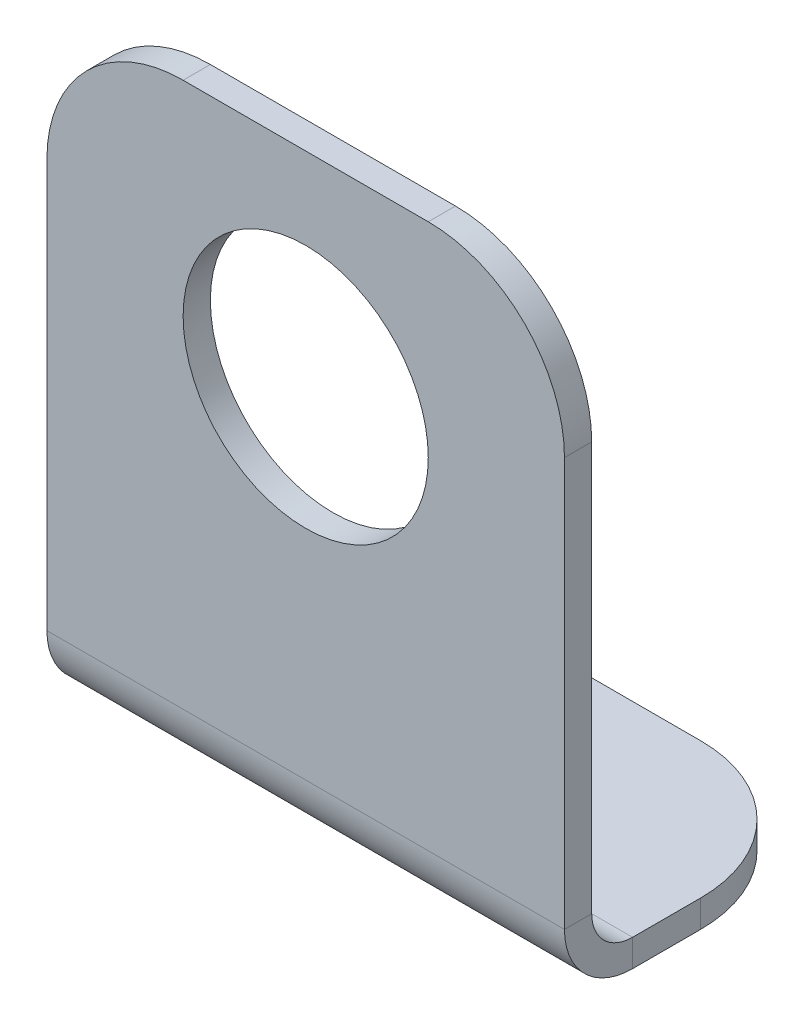
ISO-10303-21;
HEADER;
FILE_DESCRIPTION(('STEP AP214'),'2;1');
FILE_NAME('part.step','',(''),(''),'','','');
FILE_SCHEMA(('AUTOMOTIVE_DESIGN { 1 0 10303 214 1 1 1 1 }'));
ENDSEC;
DATA;
#1=APPLICATION_CONTEXT('core data for automotive mechanical design processes');
#2=APPLICATION_PROTOCOL_DEFINITION('international standard','automotive_design',2000,#1);
#3=PRODUCT_CONTEXT('',#1,'mechanical');
#4=PRODUCT('Part','Part','',(#3));
#5=PRODUCT_RELATED_PRODUCT_CATEGORY('part','',(#4));
#6=PRODUCT_DEFINITION_FORMATION('','',#4);
#7=PRODUCT_DEFINITION_CONTEXT('part definition',#1,'design');
#8=PRODUCT_DEFINITION('design','',#6,#7);
#9=PRODUCT_DEFINITION_SHAPE('','',#8);
#10=(LENGTH_UNIT() NAMED_UNIT(*) SI_UNIT(.MILLI.,.METRE.));
#11=(NAMED_UNIT(*) PLANE_ANGLE_UNIT() SI_UNIT($,.RADIAN.));
#12=(NAMED_UNIT(*) SI_UNIT($,.STERADIAN.) SOLID_ANGLE_UNIT());
#13=UNCERTAINTY_MEASURE_WITH_UNIT(LENGTH_MEASURE(1.E-05),#10,'distance_accuracy_value','');
#14=(GEOMETRIC_REPRESENTATION_CONTEXT(3) GLOBAL_UNCERTAINTY_ASSIGNED_CONTEXT((#13)) GLOBAL_UNIT_ASSIGNED_CONTEXT((#10,
#11,#12)) REPRESENTATION_CONTEXT('',''));
#15=CARTESIAN_POINT('',(0.,0.,0.));
#16=DIRECTION('',(0.,0.,1.));
#17=DIRECTION('',(1.,0.,0.));
#18=AXIS2_PLACEMENT_3D('',#15,#16,#17);
#19=CARTESIAN_POINT('',(-19.,15.,-2.));
#20=DIRECTION('',(0.,1.,0.));
#21=DIRECTION('',(0.,0.,1.));
#22=AXIS2_PLACEMENT_3D('',#19,#20,#21);
#23=PLANE('',#22);
#24=DIRECTION('',(-1.,0.,0.));
#25=VECTOR('',#24,1.);
#26=CARTESIAN_POINT('',(-19.,15.,0.));
#27=LINE('',#26,#25);
#28=CARTESIAN_POINT('',(9.,15.,0.));
#29=VERTEX_POINT('',#28);
#30=CARTESIAN_POINT('',(-9.,15.,0.));
#31=VERTEX_POINT('',#30);
#32=EDGE_CURVE('E210',#29,#31,#27,.T.);
#33=ORIENTED_EDGE('',*,*,#32,.F.);
#34=DIRECTION('',(0.,0.,1.));
#35=VECTOR('',#34,1.);
#36=CARTESIAN_POINT('',(9.,15.,-2.));
#37=LINE('',#36,#35);
#38=CARTESIAN_POINT('',(9.,15.,-2.));
#39=VERTEX_POINT('',#38);
#40=EDGE_CURVE('E262',#29,#39,#37,.F.);
#41=ORIENTED_EDGE('',*,*,#40,.T.);
#42=DIRECTION('',(-1.,0.,0.));
#43=VECTOR('',#42,1.);
#44=CARTESIAN_POINT('',(-19.,15.,-2.));
#45=LINE('',#44,#43);
#46=CARTESIAN_POINT('',(-9.,15.,-2.));
#47=VERTEX_POINT('',#46);
#48=EDGE_CURVE('E213',#39,#47,#45,.T.);
#49=ORIENTED_EDGE('',*,*,#48,.T.);
#50=DIRECTION('',(0.,0.,1.));
#51=VECTOR('',#50,1.);
#52=CARTESIAN_POINT('',(-9.,15.,-2.));
#53=LINE('',#52,#51);
#54=EDGE_CURVE('E259',#47,#31,#53,.T.);
#55=ORIENTED_EDGE('',*,*,#54,.T.);
#56=EDGE_LOOP('',(#33,#41,#49,#55));
#57=FACE_BOUND('',#56,.T.);
#58=ADVANCED_FACE('F58',(#57),#23,.T.);
#59=CARTESIAN_POINT('',(19.,-25.,-2.));
#60=DIRECTION('',(1.,0.,0.));
#61=DIRECTION('',(0.,1.,0.));
#62=AXIS2_PLACEMENT_3D('',#59,#60,#61);
#63=PLANE('',#62);
#64=DIRECTION('',(0.,1.,0.));
#65=VECTOR('',#64,1.);
#66=CARTESIAN_POINT('',(19.,-25.,-2.));
#67=LINE('',#66,#65);
#68=CARTESIAN_POINT('',(19.,-25.,-2.));
#69=VERTEX_POINT('',#68);
#70=CARTESIAN_POINT('',(19.,5.,-2.));
#71=VERTEX_POINT('',#70);
#72=EDGE_CURVE('E220',#69,#71,#67,.T.);
#73=ORIENTED_EDGE('',*,*,#72,.T.);
#74=DIRECTION('',(0.,0.,1.));
#75=VECTOR('',#74,1.);
#76=CARTESIAN_POINT('',(19.,5.,-2.));
#77=LINE('',#76,#75);
#78=CARTESIAN_POINT('',(19.,5.,0.));
#79=VERTEX_POINT('',#78);
#80=EDGE_CURVE('E252',#71,#79,#77,.T.);
#81=ORIENTED_EDGE('',*,*,#80,.T.);
#82=DIRECTION('',(0.,1.,0.));
#83=VECTOR('',#82,1.);
#84=CARTESIAN_POINT('',(19.,-25.,0.));
#85=LINE('',#84,#83);
#86=CARTESIAN_POINT('',(19.,-25.,0.));
#87=VERTEX_POINT('',#86);
#88=EDGE_CURVE('E216',#87,#79,#85,.T.);
#89=ORIENTED_EDGE('',*,*,#88,.F.);
#90=DIRECTION('',(0.,0.,1.));
#91=VECTOR('',#90,1.);
#92=CARTESIAN_POINT('',(19.,-25.,-2.));
#93=LINE('',#92,#91);
#94=EDGE_CURVE('E231',#69,#87,#93,.T.);
#95=ORIENTED_EDGE('',*,*,#94,.F.);
#96=EDGE_LOOP('',(#73,#81,#89,#95));
#97=FACE_BOUND('',#96,.T.);
#98=ADVANCED_FACE('F273',(#97),#63,.T.);
#99=CARTESIAN_POINT('',(-19.,15.,-2.));
#100=DIRECTION('',(-1.,0.,0.));
#101=DIRECTION('',(0.,-1.,0.));
#102=AXIS2_PLACEMENT_3D('',#99,#100,#101);
#103=PLANE('',#102);
#104=DIRECTION('',(0.,-1.,0.));
#105=VECTOR('',#104,1.);
#106=CARTESIAN_POINT('',(-19.,15.,0.));
#107=LINE('',#106,#105);
#108=CARTESIAN_POINT('',(-19.,5.,0.));
#109=VERTEX_POINT('',#108);
#110=CARTESIAN_POINT('',(-19.,-25.,0.));
#111=VERTEX_POINT('',#110);
#112=EDGE_CURVE('E226',#109,#111,#107,.T.);
#113=ORIENTED_EDGE('',*,*,#112,.F.);
#114=DIRECTION('',(0.,0.,1.));
#115=VECTOR('',#114,1.);
#116=CARTESIAN_POINT('',(-19.,5.,-2.));
#117=LINE('',#116,#115);
#118=CARTESIAN_POINT('',(-19.,5.,-2.));
#119=VERTEX_POINT('',#118);
#120=EDGE_CURVE('E13',#109,#119,#117,.F.);
#121=ORIENTED_EDGE('',*,*,#120,.T.);
#122=DIRECTION('',(0.,-1.,0.));
#123=VECTOR('',#122,1.);
#124=CARTESIAN_POINT('',(-19.,15.,-2.));
#125=LINE('',#124,#123);
#126=CARTESIAN_POINT('',(-19.,-25.,-2.));
#127=VERTEX_POINT('',#126);
#128=EDGE_CURVE('E215',#119,#127,#125,.T.);
#129=ORIENTED_EDGE('',*,*,#128,.T.);
#130=DIRECTION('',(0.,0.,1.));
#131=VECTOR('',#130,1.);
#132=CARTESIAN_POINT('',(-19.,-25.,-2.));
#133=LINE('',#132,#131);
#134=EDGE_CURVE('E223',#127,#111,#133,.T.);
#135=ORIENTED_EDGE('',*,*,#134,.T.);
#136=EDGE_LOOP('',(#113,#121,#129,#135));
#137=FACE_BOUND('',#136,.T.);
#138=ADVANCED_FACE('F282',(#137),#103,.T.);
#139=CARTESIAN_POINT('',(0.,0.,-2.));
#140=DIRECTION('',(0.,0.,1.));
#141=DIRECTION('',(1.,0.,0.));
#142=AXIS2_PLACEMENT_3D('',#139,#140,#141);
#143=PLANE('',#142);
#144=CARTESIAN_POINT('',(0.,0.,-2.));
#145=DIRECTION('',(0.,0.,1.));
#146=DIRECTION('',(1.,0.,0.));
#147=AXIS2_PLACEMENT_3D('',#144,#145,#146);
#148=CIRCLE('',#147,9.);
#149=CARTESIAN_POINT('',(9.,0.,-2.));
#150=VERTEX_POINT('',#149);
#151=EDGE_CURVE('E207',#150,#150,#148,.T.);
#152=ORIENTED_EDGE('',*,*,#151,.T.);
#153=EDGE_LOOP('',(#152));
#154=FACE_BOUND('',#153,.T.);
#155=ORIENTED_EDGE('',*,*,#48,.F.);
#156=CARTESIAN_POINT('',(9.,5.,-2.));
#157=DIRECTION('',(0.,0.,1.));
#158=DIRECTION('',(1.,0.,0.));
#159=AXIS2_PLACEMENT_3D('',#156,#157,#158);
#160=CIRCLE('',#159,10.);
#161=EDGE_CURVE('E66',#39,#71,#160,.F.);
#162=ORIENTED_EDGE('',*,*,#161,.T.);
#163=ORIENTED_EDGE('',*,*,#72,.F.);
#164=DIRECTION('',(1.,0.,0.));
#165=VECTOR('',#164,1.);
#166=CARTESIAN_POINT('',(-19.,-25.,-2.));
#167=LINE('',#166,#165);
#168=EDGE_CURVE('E218',#127,#69,#167,.T.);
#169=ORIENTED_EDGE('',*,*,#168,.F.);
#170=ORIENTED_EDGE('',*,*,#128,.F.);
#171=CARTESIAN_POINT('',(-9.,5.,-2.));
#172=DIRECTION('',(0.,0.,1.));
#173=DIRECTION('',(1.,0.,0.));
#174=AXIS2_PLACEMENT_3D('',#171,#172,#173);
#175=CIRCLE('',#174,10.);
#176=EDGE_CURVE('E78',#119,#47,#175,.F.);
#177=ORIENTED_EDGE('',*,*,#176,.T.);
#178=EDGE_LOOP('',(#155,#162,#163,#169,#170,#177));
#179=FACE_BOUND('',#178,.T.);
#180=ADVANCED_FACE('F266',(#154,#179),#143,.F.);
#181=CARTESIAN_POINT('',(0.,0.,0.));
#182=DIRECTION('',(0.,0.,1.));
#183=DIRECTION('',(1.,0.,0.));
#184=AXIS2_PLACEMENT_3D('',#181,#182,#183);
#185=PLANE('',#184);
#186=CARTESIAN_POINT('',(0.,0.,0.));
#187=DIRECTION('',(0.,0.,1.));
#188=DIRECTION('',(1.,0.,0.));
#189=AXIS2_PLACEMENT_3D('',#186,#187,#188);
#190=CIRCLE('',#189,9.);
#191=CARTESIAN_POINT('',(9.,0.,0.));
#192=VERTEX_POINT('',#191);
#193=EDGE_CURVE('E202',#192,#192,#190,.T.);
#194=ORIENTED_EDGE('',*,*,#193,.F.);
#195=EDGE_LOOP('',(#194));
#196=FACE_BOUND('',#195,.T.);
#197=ORIENTED_EDGE('',*,*,#88,.T.);
#198=CARTESIAN_POINT('',(9.,5.,0.));
#199=DIRECTION('',(0.,0.,1.));
#200=DIRECTION('',(1.,0.,0.));
#201=AXIS2_PLACEMENT_3D('',#198,#199,#200);
#202=CIRCLE('',#201,10.);
#203=EDGE_CURVE('E257',#79,#29,#202,.T.);
#204=ORIENTED_EDGE('',*,*,#203,.T.);
#205=ORIENTED_EDGE('',*,*,#32,.T.);
#206=CARTESIAN_POINT('',(-9.,5.,0.));
#207=DIRECTION('',(0.,0.,1.));
#208=DIRECTION('',(1.,0.,0.));
#209=AXIS2_PLACEMENT_3D('',#206,#207,#208);
#210=CIRCLE('',#209,10.);
#211=EDGE_CURVE('E255',#31,#109,#210,.T.);
#212=ORIENTED_EDGE('',*,*,#211,.T.);
#213=ORIENTED_EDGE('',*,*,#112,.T.);
#214=DIRECTION('',(1.,0.,0.));
#215=VECTOR('',#214,1.);
#216=CARTESIAN_POINT('',(-19.,-25.,0.));
#217=LINE('',#216,#215);
#218=EDGE_CURVE('E155',#111,#87,#217,.T.);
#219=ORIENTED_EDGE('',*,*,#218,.T.);
#220=EDGE_LOOP('',(#197,#204,#205,#212,#213,#219));
#221=FACE_BOUND('',#220,.T.);
#222=ADVANCED_FACE('F278',(#196,#221),#185,.T.);
#223=CARTESIAN_POINT('',(0.,0.,-2.));
#224=DIRECTION('',(0.,0.,1.));
#225=DIRECTION('',(1.,0.,0.));
#226=AXIS2_PLACEMENT_3D('',#223,#224,#225);
#227=CYLINDRICAL_SURFACE('',#226,9.);
#228=ORIENTED_EDGE('',*,*,#151,.F.);
#229=EDGE_LOOP('',(#228));
#230=FACE_BOUND('',#229,.T.);
#231=ORIENTED_EDGE('',*,*,#193,.T.);
#232=EDGE_LOOP('',(#231));
#233=FACE_BOUND('',#232,.T.);
#234=ADVANCED_FACE('F308',(#230,#233),#227,.F.);
#235=CARTESIAN_POINT('',(19.,-25.,-5.));
#236=DIRECTION('',(1.,0.,0.));
#237=DIRECTION('',(0.,0.,-1.));
#238=AXIS2_PLACEMENT_3D('',#235,#236,#237);
#239=PLANE('',#238);
#240=DIRECTION('',(0.,1.,0.));
#241=VECTOR('',#240,1.);
#242=CARTESIAN_POINT('',(19.,-30.,-4.99999999999998));
#243=LINE('',#242,#241);
#244=CARTESIAN_POINT('',(19.,-28.,-4.99999999999999));
#245=VERTEX_POINT('',#244);
#246=CARTESIAN_POINT('',(19.,-30.,-4.99999999999998));
#247=VERTEX_POINT('',#246);
#248=EDGE_CURVE('E199',#245,#247,#243,.F.);
#249=ORIENTED_EDGE('',*,*,#248,.F.);
#250=CARTESIAN_POINT('',(19.,-25.,-5.));
#251=DIRECTION('',(-1.,0.,0.));
#252=DIRECTION('',(0.,0.,1.));
#253=AXIS2_PLACEMENT_3D('',#250,#251,#252);
#254=CIRCLE('',#253,3.);
#255=EDGE_CURVE('E160',#69,#245,#254,.F.);
#256=ORIENTED_EDGE('',*,*,#255,.F.);
#257=ORIENTED_EDGE('',*,*,#94,.T.);
#258=CARTESIAN_POINT('',(19.,-25.,-5.));
#259=DIRECTION('',(-1.,0.,0.));
#260=DIRECTION('',(0.,0.,1.));
#261=AXIS2_PLACEMENT_3D('',#258,#259,#260);
#262=CIRCLE('',#261,5.);
#263=EDGE_CURVE('E159',#87,#247,#262,.F.);
#264=ORIENTED_EDGE('',*,*,#263,.T.);
#265=EDGE_LOOP('',(#249,#256,#257,#264));
#266=FACE_BOUND('',#265,.T.);
#267=ADVANCED_FACE('F306',(#266),#239,.T.);
#268=CARTESIAN_POINT('',(-19.,-25.,-5.));
#269=DIRECTION('',(1.,0.,0.));
#270=DIRECTION('',(0.,0.,-1.));
#271=AXIS2_PLACEMENT_3D('',#268,#269,#270);
#272=PLANE('',#271);
#273=CARTESIAN_POINT('',(-19.,-25.,-5.));
#274=DIRECTION('',(-1.,0.,0.));
#275=DIRECTION('',(0.,0.,1.));
#276=AXIS2_PLACEMENT_3D('',#273,#274,#275);
#277=CIRCLE('',#276,3.);
#278=CARTESIAN_POINT('',(-19.,-28.,-4.99999999999999));
#279=VERTEX_POINT('',#278);
#280=EDGE_CURVE('E167',#279,#127,#277,.T.);
#281=ORIENTED_EDGE('',*,*,#280,.F.);
#282=DIRECTION('',(0.,1.,0.));
#283=VECTOR('',#282,1.);
#284=CARTESIAN_POINT('',(-19.,-28.,-4.99999999999999));
#285=LINE('',#284,#283);
#286=CARTESIAN_POINT('',(-19.,-30.,-4.99999999999998));
#287=VERTEX_POINT('',#286);
#288=EDGE_CURVE('E164',#279,#287,#285,.F.);
#289=ORIENTED_EDGE('',*,*,#288,.T.);
#290=CARTESIAN_POINT('',(-19.,-25.,-5.));
#291=DIRECTION('',(-1.,0.,0.));
#292=DIRECTION('',(0.,0.,1.));
#293=AXIS2_PLACEMENT_3D('',#290,#291,#292);
#294=CIRCLE('',#293,5.);
#295=EDGE_CURVE('E148',#287,#111,#294,.T.);
#296=ORIENTED_EDGE('',*,*,#295,.T.);
#297=ORIENTED_EDGE('',*,*,#134,.F.);
#298=EDGE_LOOP('',(#281,#289,#296,#297));
#299=FACE_BOUND('',#298,.T.);
#300=ADVANCED_FACE('F165',(#299),#272,.F.);
#301=CARTESIAN_POINT('',(-19.,-25.,-5.));
#302=DIRECTION('',(-1.,0.,0.));
#303=DIRECTION('',(0.,-1.,0.));
#304=AXIS2_PLACEMENT_3D('',#301,#302,#303);
#305=CYLINDRICAL_SURFACE('',#304,5.);
#306=ORIENTED_EDGE('',*,*,#218,.F.);
#307=ORIENTED_EDGE('',*,*,#295,.F.);
#308=DIRECTION('',(-1.,0.,0.));
#309=VECTOR('',#308,1.);
#310=CARTESIAN_POINT('',(19.,-30.,-4.99999999999998));
#311=LINE('',#310,#309);
#312=EDGE_CURVE('E152',#287,#247,#311,.F.);
#313=ORIENTED_EDGE('',*,*,#312,.T.);
#314=ORIENTED_EDGE('',*,*,#263,.F.);
#315=EDGE_LOOP('',(#306,#307,#313,#314));
#316=FACE_BOUND('',#315,.T.);
#317=ADVANCED_FACE('F150',(#316),#305,.T.);
#318=CARTESIAN_POINT('',(-19.,-25.,-5.));
#319=DIRECTION('',(-1.,0.,0.));
#320=DIRECTION('',(0.,-1.,0.));
#321=AXIS2_PLACEMENT_3D('',#318,#319,#320);
#322=CYLINDRICAL_SURFACE('',#321,3.);
#323=ORIENTED_EDGE('',*,*,#168,.T.);
#324=ORIENTED_EDGE('',*,*,#255,.T.);
#325=DIRECTION('',(-1.,0.,0.));
#326=VECTOR('',#325,1.);
#327=CARTESIAN_POINT('',(19.,-28.,-4.99999999999999));
#328=LINE('',#327,#326);
#329=EDGE_CURVE('E172',#245,#279,#328,.T.);
#330=ORIENTED_EDGE('',*,*,#329,.T.);
#331=ORIENTED_EDGE('',*,*,#280,.T.);
#332=EDGE_LOOP('',(#323,#324,#330,#331));
#333=FACE_BOUND('',#332,.T.);
#334=ADVANCED_FACE('F284',(#333),#322,.F.);
#335=CARTESIAN_POINT('',(-19.,-30.0000000000001,-20.));
#336=DIRECTION('',(1.,0.,0.));
#337=DIRECTION('',(0.,0.,-1.));
#338=AXIS2_PLACEMENT_3D('',#335,#336,#337);
#339=PLANE('',#338);
#340=DIRECTION('',(0.,0.,1.));
#341=VECTOR('',#340,1.);
#342=CARTESIAN_POINT('',(-19.,-28.0000000000001,-20.));
#343=LINE('',#342,#341);
#344=CARTESIAN_POINT('',(-19.,-28.,-10.));
#345=VERTEX_POINT('',#344);
#346=EDGE_CURVE('E181',#279,#345,#343,.F.);
#347=ORIENTED_EDGE('',*,*,#346,.T.);
#348=DIRECTION('',(0.,1.,0.));
#349=VECTOR('',#348,1.);
#350=CARTESIAN_POINT('',(-19.,-30.,-10.));
#351=LINE('',#350,#349);
#352=CARTESIAN_POINT('',(-19.,-30.,-10.));
#353=VERTEX_POINT('',#352);
#354=EDGE_CURVE('E185',#345,#353,#351,.F.);
#355=ORIENTED_EDGE('',*,*,#354,.T.);
#356=DIRECTION('',(0.,0.,-1.));
#357=VECTOR('',#356,1.);
#358=CARTESIAN_POINT('',(-19.,-30.,0.));
#359=LINE('',#358,#357);
#360=EDGE_CURVE('E177',#287,#353,#359,.T.);
#361=ORIENTED_EDGE('',*,*,#360,.F.);
#362=ORIENTED_EDGE('',*,*,#288,.F.);
#363=EDGE_LOOP('',(#347,#355,#361,#362));
#364=FACE_BOUND('',#363,.T.);
#365=ADVANCED_FACE('F183',(#364),#339,.F.);
#366=CARTESIAN_POINT('',(19.,-30.,-1.99999999999999));
#367=DIRECTION('',(-1.,0.,0.));
#368=DIRECTION('',(0.,0.,1.));
#369=AXIS2_PLACEMENT_3D('',#366,#367,#368);
#370=PLANE('',#369);
#371=DIRECTION('',(0.,0.,1.));
#372=VECTOR('',#371,1.);
#373=CARTESIAN_POINT('',(19.,-30.,0.));
#374=LINE('',#373,#372);
#375=CARTESIAN_POINT('',(19.,-30.,-10.));
#376=VERTEX_POINT('',#375);
#377=EDGE_CURVE('E180',#376,#247,#374,.T.);
#378=ORIENTED_EDGE('',*,*,#377,.F.);
#379=DIRECTION('',(0.,1.,0.));
#380=VECTOR('',#379,1.);
#381=CARTESIAN_POINT('',(19.,-30.,-10.));
#382=LINE('',#381,#380);
#383=CARTESIAN_POINT('',(19.,-28.,-10.));
#384=VERTEX_POINT('',#383);
#385=EDGE_CURVE('E249',#376,#384,#382,.T.);
#386=ORIENTED_EDGE('',*,*,#385,.T.);
#387=DIRECTION('',(0.,0.,-1.));
#388=VECTOR('',#387,1.);
#389=CARTESIAN_POINT('',(19.,-28.,-2.));
#390=LINE('',#389,#388);
#391=EDGE_CURVE('E187',#384,#245,#390,.F.);
#392=ORIENTED_EDGE('',*,*,#391,.T.);
#393=ORIENTED_EDGE('',*,*,#248,.T.);
#394=EDGE_LOOP('',(#378,#386,#392,#393));
#395=FACE_BOUND('',#394,.T.);
#396=ADVANCED_FACE('F303',(#395),#370,.F.);
#397=CARTESIAN_POINT('',(0.,-30.,0.));
#398=DIRECTION('',(0.,1.,0.));
#399=DIRECTION('',(0.,0.,1.));
#400=AXIS2_PLACEMENT_3D('',#397,#398,#399);
#401=PLANE('',#400);
#402=ORIENTED_EDGE('',*,*,#360,.T.);
#403=CARTESIAN_POINT('',(-8.99999999999999,-30.,-10.));
#404=DIRECTION('',(0.,1.,0.));
#405=DIRECTION('',(0.,0.,1.));
#406=AXIS2_PLACEMENT_3D('',#403,#404,#405);
#407=CIRCLE('',#406,10.);
#408=CARTESIAN_POINT('',(-8.99999999999999,-30.0000000000001,-20.));
#409=VERTEX_POINT('',#408);
#410=EDGE_CURVE('E247',#353,#409,#407,.F.);
#411=ORIENTED_EDGE('',*,*,#410,.T.);
#412=DIRECTION('',(1.,0.,0.));
#413=VECTOR('',#412,1.);
#414=CARTESIAN_POINT('',(0.,-30.0000000000001,-20.));
#415=LINE('',#414,#413);
#416=CARTESIAN_POINT('',(9.,-30.0000000000001,-20.));
#417=VERTEX_POINT('',#416);
#418=EDGE_CURVE('E186',#409,#417,#415,.T.);
#419=ORIENTED_EDGE('',*,*,#418,.T.);
#420=CARTESIAN_POINT('',(9.,-30.,-10.));
#421=DIRECTION('',(0.,1.,0.));
#422=DIRECTION('',(0.,0.,1.));
#423=AXIS2_PLACEMENT_3D('',#420,#421,#422);
#424=CIRCLE('',#423,10.);
#425=EDGE_CURVE('E245',#417,#376,#424,.F.);
#426=ORIENTED_EDGE('',*,*,#425,.T.);
#427=ORIENTED_EDGE('',*,*,#377,.T.);
#428=ORIENTED_EDGE('',*,*,#312,.F.);
#429=EDGE_LOOP('',(#402,#411,#419,#426,#427,#428));
#430=FACE_BOUND('',#429,.T.);
#431=ADVANCED_FACE('F176',(#430),#401,.F.);
#432=CARTESIAN_POINT('',(0.,-28.,0.));
#433=DIRECTION('',(0.,1.,0.));
#434=DIRECTION('',(0.,0.,1.));
#435=AXIS2_PLACEMENT_3D('',#432,#433,#434);
#436=PLANE('',#435);
#437=DIRECTION('',(-1.,0.,0.));
#438=VECTOR('',#437,1.);
#439=CARTESIAN_POINT('',(19.,-28.0000000000001,-20.));
#440=LINE('',#439,#438);
#441=CARTESIAN_POINT('',(-8.99999999999999,-28.0000000000001,-20.));
#442=VERTEX_POINT('',#441);
#443=CARTESIAN_POINT('',(9.,-28.0000000000001,-20.));
#444=VERTEX_POINT('',#443);
#445=EDGE_CURVE('E191',#442,#444,#440,.F.);
#446=ORIENTED_EDGE('',*,*,#445,.F.);
#447=CARTESIAN_POINT('',(-8.99999999999999,-28.,-10.));
#448=DIRECTION('',(0.,1.,0.));
#449=DIRECTION('',(0.,0.,1.));
#450=AXIS2_PLACEMENT_3D('',#447,#448,#449);
#451=CIRCLE('',#450,10.);
#452=EDGE_CURVE('E242',#442,#345,#451,.T.);
#453=ORIENTED_EDGE('',*,*,#452,.T.);
#454=ORIENTED_EDGE('',*,*,#346,.F.);
#455=ORIENTED_EDGE('',*,*,#329,.F.);
#456=ORIENTED_EDGE('',*,*,#391,.F.);
#457=CARTESIAN_POINT('',(9.,-28.,-10.));
#458=DIRECTION('',(0.,1.,0.));
#459=DIRECTION('',(0.,0.,1.));
#460=AXIS2_PLACEMENT_3D('',#457,#458,#459);
#461=CIRCLE('',#460,10.);
#462=EDGE_CURVE('E240',#384,#444,#461,.T.);
#463=ORIENTED_EDGE('',*,*,#462,.T.);
#464=EDGE_LOOP('',(#446,#453,#454,#455,#456,#463));
#465=FACE_BOUND('',#464,.T.);
#466=ADVANCED_FACE('F290',(#465),#436,.T.);
#467=CARTESIAN_POINT('',(19.,-30.0000000000001,-20.));
#468=DIRECTION('',(0.,0.,1.));
#469=DIRECTION('',(0.,-1.,0.));
#470=AXIS2_PLACEMENT_3D('',#467,#468,#469);
#471=PLANE('',#470);
#472=ORIENTED_EDGE('',*,*,#418,.F.);
#473=DIRECTION('',(0.,1.,0.));
#474=VECTOR('',#473,1.);
#475=CARTESIAN_POINT('',(-8.99999999999999,-30.0000000000001,-20.));
#476=LINE('',#475,#474);
#477=EDGE_CURVE('E237',#409,#442,#476,.T.);
#478=ORIENTED_EDGE('',*,*,#477,.T.);
#479=ORIENTED_EDGE('',*,*,#445,.T.);
#480=DIRECTION('',(0.,1.,0.));
#481=VECTOR('',#480,1.);
#482=CARTESIAN_POINT('',(9.,-30.0000000000001,-20.));
#483=LINE('',#482,#481);
#484=EDGE_CURVE('E234',#444,#417,#483,.F.);
#485=ORIENTED_EDGE('',*,*,#484,.T.);
#486=EDGE_LOOP('',(#472,#478,#479,#485));
#487=FACE_BOUND('',#486,.T.);
#488=ADVANCED_FACE('F297',(#487),#471,.F.);
#489=CARTESIAN_POINT('',(-8.99999999999999,-30.,-10.));
#490=DIRECTION('',(0.,1.,0.));
#491=DIRECTION('',(0.,0.,1.));
#492=AXIS2_PLACEMENT_3D('',#489,#490,#491);
#493=CYLINDRICAL_SURFACE('',#492,10.);
#494=ORIENTED_EDGE('',*,*,#410,.F.);
#495=ORIENTED_EDGE('',*,*,#354,.F.);
#496=ORIENTED_EDGE('',*,*,#452,.F.);
#497=ORIENTED_EDGE('',*,*,#477,.F.);
#498=EDGE_LOOP('',(#494,#495,#496,#497));
#499=FACE_BOUND('',#498,.T.);
#500=ADVANCED_FACE('F292',(#499),#493,.T.);
#501=CARTESIAN_POINT('',(9.,-30.,-10.));
#502=DIRECTION('',(0.,1.,0.));
#503=DIRECTION('',(0.,0.,1.));
#504=AXIS2_PLACEMENT_3D('',#501,#502,#503);
#505=CYLINDRICAL_SURFACE('',#504,10.);
#506=ORIENTED_EDGE('',*,*,#425,.F.);
#507=ORIENTED_EDGE('',*,*,#484,.F.);
#508=ORIENTED_EDGE('',*,*,#462,.F.);
#509=ORIENTED_EDGE('',*,*,#385,.F.);
#510=EDGE_LOOP('',(#506,#507,#508,#509));
#511=FACE_BOUND('',#510,.T.);
#512=ADVANCED_FACE('F300',(#511),#505,.T.);
#513=CARTESIAN_POINT('',(9.,5.,-2.));
#514=DIRECTION('',(0.,0.,1.));
#515=DIRECTION('',(1.,0.,0.));
#516=AXIS2_PLACEMENT_3D('',#513,#514,#515);
#517=CYLINDRICAL_SURFACE('',#516,10.);
#518=ORIENTED_EDGE('',*,*,#161,.F.);
#519=ORIENTED_EDGE('',*,*,#40,.F.);
#520=ORIENTED_EDGE('',*,*,#203,.F.);
#521=ORIENTED_EDGE('',*,*,#80,.F.);
#522=EDGE_LOOP('',(#518,#519,#520,#521));
#523=FACE_BOUND('',#522,.T.);
#524=ADVANCED_FACE('F275',(#523),#517,.T.);
#525=CARTESIAN_POINT('',(-9.,5.,-2.));
#526=DIRECTION('',(0.,0.,1.));
#527=DIRECTION('',(1.,0.,0.));
#528=AXIS2_PLACEMENT_3D('',#525,#526,#527);
#529=CYLINDRICAL_SURFACE('',#528,10.);
#530=ORIENTED_EDGE('',*,*,#176,.F.);
#531=ORIENTED_EDGE('',*,*,#120,.F.);
#532=ORIENTED_EDGE('',*,*,#211,.F.);
#533=ORIENTED_EDGE('',*,*,#54,.F.);
#534=EDGE_LOOP('',(#530,#531,#532,#533));
#535=FACE_BOUND('',#534,.T.);
#536=ADVANCED_FACE('F60',(#535),#529,.T.);
#537=CLOSED_SHELL('',(#58,#98,#138,#180,#222,#234,#267,#300,#317,#334,#365,#396,#431,#466,#488,
#500,#512,#524,#536));
#538=MANIFOLD_SOLID_BREP('B2',#537);
#539=ADVANCED_BREP_SHAPE_REPRESENTATION('',(#18,#538),#14);
#540=SHAPE_DEFINITION_REPRESENTATION(#9,#539);
ENDSEC;
END-ISO-10303-21;
